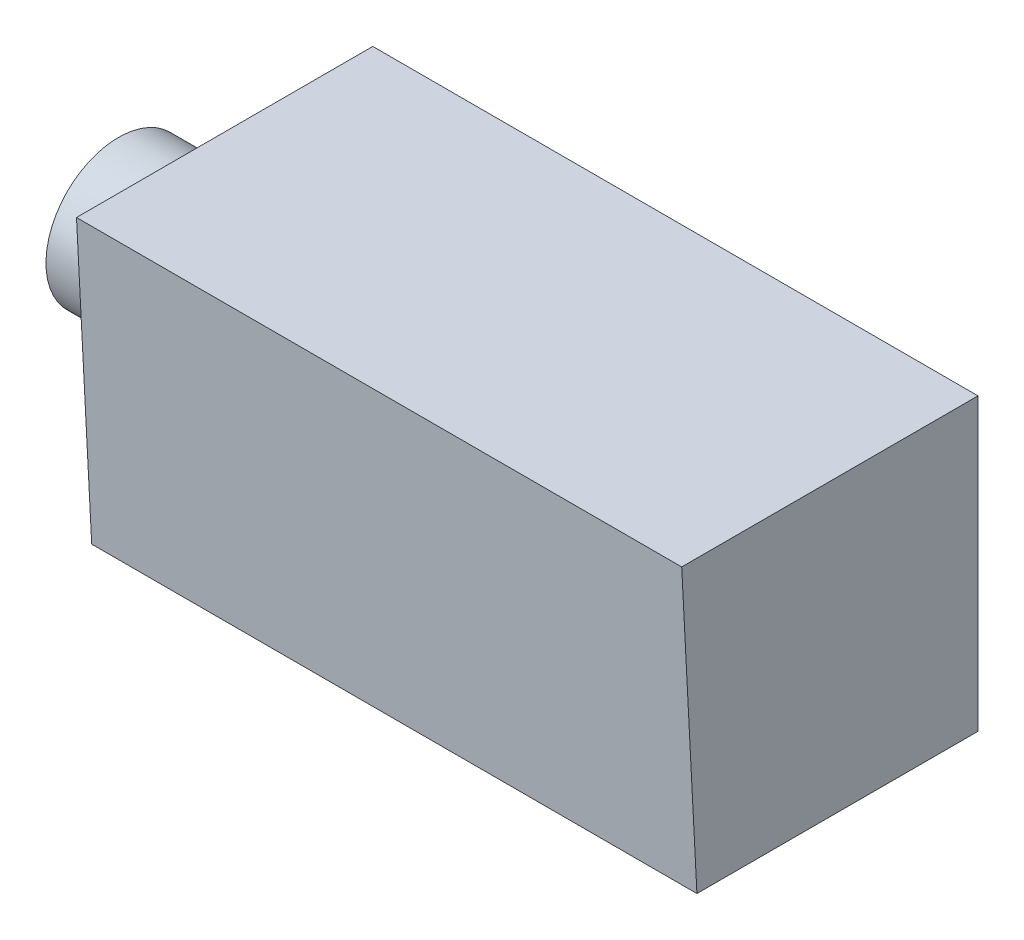
ISO-10303-21;
HEADER;
FILE_DESCRIPTION(('STEP AP214'),'2;1');
FILE_NAME('part.step','',(''),(''),'','','');
FILE_SCHEMA(('AUTOMOTIVE_DESIGN { 1 0 10303 214 1 1 1 1 }'));
ENDSEC;
DATA;
#1=APPLICATION_CONTEXT('core data for automotive mechanical design processes');
#2=APPLICATION_PROTOCOL_DEFINITION('international standard','automotive_design',2000,#1);
#3=PRODUCT_CONTEXT('',#1,'mechanical');
#4=PRODUCT('Part','Part','',(#3));
#5=PRODUCT_RELATED_PRODUCT_CATEGORY('part','',(#4));
#6=PRODUCT_DEFINITION_FORMATION('','',#4);
#7=PRODUCT_DEFINITION_CONTEXT('part definition',#1,'design');
#8=PRODUCT_DEFINITION('design','',#6,#7);
#9=PRODUCT_DEFINITION_SHAPE('','',#8);
#10=(LENGTH_UNIT() NAMED_UNIT(*) SI_UNIT(.MILLI.,.METRE.));
#11=(NAMED_UNIT(*) PLANE_ANGLE_UNIT() SI_UNIT($,.RADIAN.));
#12=(NAMED_UNIT(*) SI_UNIT($,.STERADIAN.) SOLID_ANGLE_UNIT());
#13=UNCERTAINTY_MEASURE_WITH_UNIT(LENGTH_MEASURE(1.E-05),#10,'distance_accuracy_value','');
#14=(GEOMETRIC_REPRESENTATION_CONTEXT(3) GLOBAL_UNCERTAINTY_ASSIGNED_CONTEXT((#13)) GLOBAL_UNIT_ASSIGNED_CONTEXT((#10,
#11,#12)) REPRESENTATION_CONTEXT('',''));
#15=CARTESIAN_POINT('',(0.,0.,0.));
#16=DIRECTION('',(0.,0.,1.));
#17=DIRECTION('',(1.,0.,0.));
#18=AXIS2_PLACEMENT_3D('',#15,#16,#17);
#19=CARTESIAN_POINT('',(80.,-28.,-107.));
#20=DIRECTION('',(0.,-1.,0.));
#21=DIRECTION('',(1.,0.,0.));
#22=AXIS2_PLACEMENT_3D('',#19,#20,#21);
#23=PLANE('',#22);
#24=DIRECTION('',(-1.,0.,0.));
#25=VECTOR('',#24,1.);
#26=CARTESIAN_POINT('',(80.,-28.,-107.));
#27=LINE('',#26,#25);
#28=CARTESIAN_POINT('',(65.,-28.,-107.));
#29=VERTEX_POINT('',#28);
#30=CARTESIAN_POINT('',(40.,-28.,-107.));
#31=VERTEX_POINT('',#30);
#32=EDGE_CURVE('E90',#29,#31,#27,.T.);
#33=ORIENTED_EDGE('',*,*,#32,.T.);
#34=DIRECTION('',(0.,0.,-1.));
#35=VECTOR('',#34,1.);
#36=CARTESIAN_POINT('',(40.,-28.,-94.7605805656528));
#37=LINE('',#36,#35);
#38=CARTESIAN_POINT('',(40.,-28.,-94.7605805656528));
#39=VERTEX_POINT('',#38);
#40=EDGE_CURVE('E51',#39,#31,#37,.T.);
#41=ORIENTED_EDGE('',*,*,#40,.F.);
#42=DIRECTION('',(-1.,0.,0.));
#43=VECTOR('',#42,1.);
#44=CARTESIAN_POINT('',(80.,-28.,-94.7605805656528));
#45=LINE('',#44,#43);
#46=CARTESIAN_POINT('',(65.,-28.,-94.7605805656528));
#47=VERTEX_POINT('',#46);
#48=EDGE_CURVE('E39',#47,#39,#45,.T.);
#49=ORIENTED_EDGE('',*,*,#48,.F.);
#50=DIRECTION('',(0.,0.,-1.));
#51=VECTOR('',#50,1.);
#52=CARTESIAN_POINT('',(65.,-28.,-94.7605805656528));
#53=LINE('',#52,#51);
#54=EDGE_CURVE('E104',#47,#29,#53,.T.);
#55=ORIENTED_EDGE('',*,*,#54,.T.);
#56=EDGE_LOOP('',(#33,#41,#49,#55));
#57=FACE_BOUND('',#56,.T.);
#58=ADVANCED_FACE('F36',(#57),#23,.F.);
#59=CARTESIAN_POINT('',(80.,-28.,-94.7605805656528));
#60=DIRECTION('',(0.,0.0523359562429478,-0.998629534754574));
#61=DIRECTION('',(0.,0.998629534754574,0.0523359562429478));
#62=AXIS2_PLACEMENT_3D('',#59,#60,#61);
#63=PLANE('',#62);
#64=ORIENTED_EDGE('',*,*,#48,.T.);
#65=DIRECTION('',(0.,-0.998629534754574,-0.0523359562429478));
#66=VECTOR('',#65,1.);
#67=CARTESIAN_POINT('',(40.,-28.,-94.7605805656528));
#68=LINE('',#67,#66);
#69=CARTESIAN_POINT('',(40.,-40.,-95.3894739170494));
#70=VERTEX_POINT('',#69);
#71=EDGE_CURVE('E75',#39,#70,#68,.T.);
#72=ORIENTED_EDGE('',*,*,#71,.T.);
#73=DIRECTION('',(-1.,0.,0.));
#74=VECTOR('',#73,1.);
#75=CARTESIAN_POINT('',(80.,-40.,-95.3894739170494));
#76=LINE('',#75,#74);
#77=CARTESIAN_POINT('',(65.,-40.,-95.3894739170494));
#78=VERTEX_POINT('',#77);
#79=EDGE_CURVE('E96',#78,#70,#76,.T.);
#80=ORIENTED_EDGE('',*,*,#79,.F.);
#81=DIRECTION('',(0.,0.998629534754574,0.0523359562429478));
#82=VECTOR('',#81,1.);
#83=CARTESIAN_POINT('',(65.,-28.,-94.7605805656528));
#84=LINE('',#83,#82);
#85=EDGE_CURVE('E95',#78,#47,#84,.T.);
#86=ORIENTED_EDGE('',*,*,#85,.T.);
#87=EDGE_LOOP('',(#64,#72,#80,#86));
#88=FACE_BOUND('',#87,.T.);
#89=ADVANCED_FACE('F94',(#88),#63,.F.);
#90=CARTESIAN_POINT('',(80.,-40.,-95.3894739170494));
#91=DIRECTION('',(0.,1.,0.));
#92=DIRECTION('',(-1.,0.,0.));
#93=AXIS2_PLACEMENT_3D('',#90,#91,#92);
#94=PLANE('',#93);
#95=ORIENTED_EDGE('',*,*,#79,.T.);
#96=DIRECTION('',(0.,0.,-1.));
#97=VECTOR('',#96,1.);
#98=CARTESIAN_POINT('',(40.,-40.,-94.7605805656528));
#99=LINE('',#98,#97);
#100=CARTESIAN_POINT('',(40.,-40.,-107.));
#101=VERTEX_POINT('',#100);
#102=EDGE_CURVE('E78',#70,#101,#99,.T.);
#103=ORIENTED_EDGE('',*,*,#102,.T.);
#104=DIRECTION('',(-1.,0.,0.));
#105=VECTOR('',#104,1.);
#106=CARTESIAN_POINT('',(80.,-40.,-107.));
#107=LINE('',#106,#105);
#108=CARTESIAN_POINT('',(65.,-40.,-107.));
#109=VERTEX_POINT('',#108);
#110=EDGE_CURVE('E97',#109,#101,#107,.T.);
#111=ORIENTED_EDGE('',*,*,#110,.F.);
#112=DIRECTION('',(0.,0.,-1.));
#113=VECTOR('',#112,1.);
#114=CARTESIAN_POINT('',(65.,-40.,-94.7605805656528));
#115=LINE('',#114,#113);
#116=EDGE_CURVE('E59',#78,#109,#115,.T.);
#117=ORIENTED_EDGE('',*,*,#116,.F.);
#118=EDGE_LOOP('',(#95,#103,#111,#117));
#119=FACE_BOUND('',#118,.T.);
#120=ADVANCED_FACE('F134',(#119),#94,.F.);
#121=CARTESIAN_POINT('',(80.,-40.,-107.));
#122=DIRECTION('',(0.,0.,1.));
#123=DIRECTION('',(1.,0.,0.));
#124=AXIS2_PLACEMENT_3D('',#121,#122,#123);
#125=PLANE('',#124);
#126=ORIENTED_EDGE('',*,*,#110,.T.);
#127=DIRECTION('',(0.,-1.,0.));
#128=VECTOR('',#127,1.);
#129=CARTESIAN_POINT('',(40.,-28.,-107.));
#130=LINE('',#129,#128);
#131=EDGE_CURVE('E91',#31,#101,#130,.T.);
#132=ORIENTED_EDGE('',*,*,#131,.F.);
#133=ORIENTED_EDGE('',*,*,#32,.F.);
#134=DIRECTION('',(0.,1.,0.));
#135=VECTOR('',#134,1.);
#136=CARTESIAN_POINT('',(65.,-28.,-107.));
#137=LINE('',#136,#135);
#138=EDGE_CURVE('E83',#109,#29,#137,.T.);
#139=ORIENTED_EDGE('',*,*,#138,.F.);
#140=EDGE_LOOP('',(#126,#132,#133,#139));
#141=FACE_BOUND('',#140,.T.);
#142=ADVANCED_FACE('F128',(#141),#125,.F.);
#143=CARTESIAN_POINT('',(65.,-28.,-94.7605805656528));
#144=DIRECTION('',(-1.,0.,0.));
#145=DIRECTION('',(0.,0.,1.));
#146=AXIS2_PLACEMENT_3D('',#143,#144,#145);
#147=PLANE('',#146);
#148=ORIENTED_EDGE('',*,*,#116,.T.);
#149=ORIENTED_EDGE('',*,*,#138,.T.);
#150=ORIENTED_EDGE('',*,*,#54,.F.);
#151=ORIENTED_EDGE('',*,*,#85,.F.);
#152=EDGE_LOOP('',(#148,#149,#150,#151));
#153=FACE_BOUND('',#152,.T.);
#154=ADVANCED_FACE('F123',(#153),#147,.F.);
#155=CARTESIAN_POINT('',(40.,-28.,-94.7605805656528));
#156=DIRECTION('',(1.,0.,0.));
#157=DIRECTION('',(0.,1.,0.));
#158=AXIS2_PLACEMENT_3D('',#155,#156,#157);
#159=PLANE('',#158);
#160=CARTESIAN_POINT('',(40.,-34.,-101.5));
#161=DIRECTION('',(-1.,0.,0.));
#162=DIRECTION('',(0.,-1.,0.));
#163=AXIS2_PLACEMENT_3D('',#160,#161,#162);
#164=CIRCLE('',#163,3.00000000000001);
#165=CARTESIAN_POINT('',(40.,-37.,-101.5));
#166=VERTEX_POINT('',#165);
#167=EDGE_CURVE('E11',#166,#166,#164,.T.);
#168=ORIENTED_EDGE('',*,*,#167,.F.);
#169=EDGE_LOOP('',(#168));
#170=FACE_BOUND('',#169,.T.);
#171=ORIENTED_EDGE('',*,*,#40,.T.);
#172=ORIENTED_EDGE('',*,*,#131,.T.);
#173=ORIENTED_EDGE('',*,*,#102,.F.);
#174=ORIENTED_EDGE('',*,*,#71,.F.);
#175=EDGE_LOOP('',(#171,#172,#173,#174));
#176=FACE_BOUND('',#175,.T.);
#177=ADVANCED_FACE('F76',(#170,#176),#159,.F.);
#178=CARTESIAN_POINT('',(35.,-34.,-101.5));
#179=DIRECTION('',(1.,0.,0.));
#180=DIRECTION('',(0.,1.,0.));
#181=AXIS2_PLACEMENT_3D('',#178,#179,#180);
#182=CYLINDRICAL_SURFACE('',#181,3.00000000000001);
#183=CARTESIAN_POINT('',(35.,-34.,-101.5));
#184=DIRECTION('',(-1.,0.,0.));
#185=DIRECTION('',(0.,-1.,0.));
#186=AXIS2_PLACEMENT_3D('',#183,#184,#185);
#187=CIRCLE('',#186,3.00000000000001);
#188=CARTESIAN_POINT('',(35.,-37.,-101.5));
#189=VERTEX_POINT('',#188);
#190=EDGE_CURVE('E109',#189,#189,#187,.T.);
#191=ORIENTED_EDGE('',*,*,#190,.F.);
#192=EDGE_LOOP('',(#191));
#193=FACE_BOUND('',#192,.T.);
#194=ORIENTED_EDGE('',*,*,#167,.T.);
#195=EDGE_LOOP('',(#194));
#196=FACE_BOUND('',#195,.T.);
#197=ADVANCED_FACE('F116',(#193,#196),#182,.T.);
#198=CARTESIAN_POINT('',(35.,-34.,-101.5));
#199=DIRECTION('',(-1.,0.,0.));
#200=DIRECTION('',(0.,-1.,0.));
#201=AXIS2_PLACEMENT_3D('',#198,#199,#200);
#202=PLANE('',#201);
#203=ORIENTED_EDGE('',*,*,#190,.T.);
#204=EDGE_LOOP('',(#203));
#205=FACE_BOUND('',#204,.T.);
#206=ADVANCED_FACE('F114',(#205),#202,.T.);
#207=CLOSED_SHELL('',(#58,#89,#120,#142,#154,#177,#197,#206));
#208=MANIFOLD_SOLID_BREP('B2',#207);
#209=ADVANCED_BREP_SHAPE_REPRESENTATION('',(#18,#208),#14);
#210=SHAPE_DEFINITION_REPRESENTATION(#9,#209);
ENDSEC;
END-ISO-10303-21;
